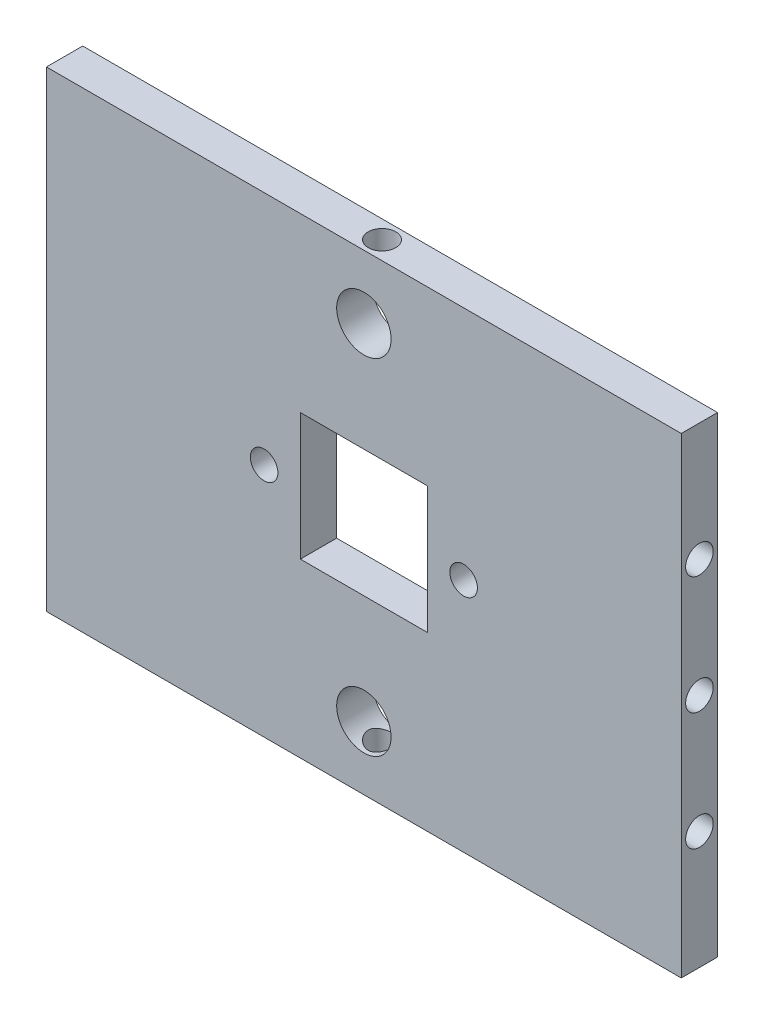
ISO-10303-21;
HEADER;
FILE_DESCRIPTION(('STEP AP214'),'2;1');
FILE_NAME('part.step','',(''),(''),'','','');
FILE_SCHEMA(('AUTOMOTIVE_DESIGN { 1 0 10303 214 1 1 1 1 }'));
ENDSEC;
DATA;
#1=APPLICATION_CONTEXT('core data for automotive mechanical design processes');
#2=APPLICATION_PROTOCOL_DEFINITION('international standard','automotive_design',2000,#1);
#3=PRODUCT_CONTEXT('',#1,'mechanical');
#4=PRODUCT('Part','Part','',(#3));
#5=PRODUCT_RELATED_PRODUCT_CATEGORY('part','',(#4));
#6=PRODUCT_DEFINITION_FORMATION('','',#4);
#7=PRODUCT_DEFINITION_CONTEXT('part definition',#1,'design');
#8=PRODUCT_DEFINITION('design','',#6,#7);
#9=PRODUCT_DEFINITION_SHAPE('','',#8);
#10=(LENGTH_UNIT() NAMED_UNIT(*) SI_UNIT(.MILLI.,.METRE.));
#11=(NAMED_UNIT(*) PLANE_ANGLE_UNIT() SI_UNIT($,.RADIAN.));
#12=(NAMED_UNIT(*) SI_UNIT($,.STERADIAN.) SOLID_ANGLE_UNIT());
#13=UNCERTAINTY_MEASURE_WITH_UNIT(LENGTH_MEASURE(1.E-05),#10,'distance_accuracy_value','');
#14=(GEOMETRIC_REPRESENTATION_CONTEXT(3) GLOBAL_UNCERTAINTY_ASSIGNED_CONTEXT((#13)) GLOBAL_UNIT_ASSIGNED_CONTEXT((#10,
#11,#12)) REPRESENTATION_CONTEXT('',''));
#15=CARTESIAN_POINT('',(0.,0.,0.));
#16=DIRECTION('',(0.,0.,1.));
#17=DIRECTION('',(1.,0.,0.));
#18=AXIS2_PLACEMENT_3D('',#15,#16,#17);
#19=CARTESIAN_POINT('',(55.5625,-41.275,6.35));
#20=DIRECTION('',(0.,1.,0.));
#21=DIRECTION('',(-1.,0.,0.));
#22=AXIS2_PLACEMENT_3D('',#19,#20,#21);
#23=PLANE('',#22);
#24=DIRECTION('',(1.,0.,0.));
#25=VECTOR('',#24,1.);
#26=CARTESIAN_POINT('',(55.5625,-41.275,0.));
#27=LINE('',#26,#25);
#28=CARTESIAN_POINT('',(-55.5625,-41.275,0.));
#29=VERTEX_POINT('',#28);
#30=CARTESIAN_POINT('',(55.5625,-41.275,0.));
#31=VERTEX_POINT('',#30);
#32=EDGE_CURVE('E203',#29,#31,#27,.T.);
#33=ORIENTED_EDGE('',*,*,#32,.T.);
#34=DIRECTION('',(0.,0.,-1.));
#35=VECTOR('',#34,1.);
#36=CARTESIAN_POINT('',(55.5625,-41.275,6.35));
#37=LINE('',#36,#35);
#38=CARTESIAN_POINT('',(55.5625,-41.275,6.35));
#39=VERTEX_POINT('',#38);
#40=EDGE_CURVE('E213',#39,#31,#37,.T.);
#41=ORIENTED_EDGE('',*,*,#40,.F.);
#42=DIRECTION('',(1.,0.,0.));
#43=VECTOR('',#42,1.);
#44=CARTESIAN_POINT('',(55.5625,-41.275,6.35));
#45=LINE('',#44,#43);
#46=CARTESIAN_POINT('',(-55.5625,-41.275,6.35));
#47=VERTEX_POINT('',#46);
#48=EDGE_CURVE('E193',#47,#39,#45,.T.);
#49=ORIENTED_EDGE('',*,*,#48,.F.);
#50=DIRECTION('',(0.,0.,-1.));
#51=VECTOR('',#50,1.);
#52=CARTESIAN_POINT('',(-55.5625,-41.275,6.35));
#53=LINE('',#52,#51);
#54=EDGE_CURVE('E216',#47,#29,#53,.T.);
#55=ORIENTED_EDGE('',*,*,#54,.T.);
#56=EDGE_LOOP('',(#33,#41,#49,#55));
#57=FACE_BOUND('',#56,.T.);
#58=CARTESIAN_POINT('',(0.,-41.275,3.175));
#59=DIRECTION('',(0.,1.,0.));
#60=DIRECTION('',(-1.,0.,0.));
#61=AXIS2_PLACEMENT_3D('',#58,#59,#60);
#62=CIRCLE('',#61,2.413);
#63=CARTESIAN_POINT('',(-2.41299999999999,-41.275,3.175));
#64=VERTEX_POINT('',#63);
#65=EDGE_CURVE('E133',#64,#64,#62,.T.);
#66=ORIENTED_EDGE('',*,*,#65,.T.);
#67=EDGE_LOOP('',(#66));
#68=FACE_BOUND('',#67,.T.);
#69=ADVANCED_FACE('F32',(#57,#68),#23,.F.);
#70=CARTESIAN_POINT('',(0.,-30.1625,6.35));
#71=DIRECTION('',(0.,0.,-1.));
#72=DIRECTION('',(-1.,0.,0.));
#73=AXIS2_PLACEMENT_3D('',#70,#71,#72);
#74=CYLINDRICAL_SURFACE('',#73,4.7625);
#75=CARTESIAN_POINT('',(0.,-30.1625,0.));
#76=DIRECTION('',(0.,0.,1.));
#77=DIRECTION('',(-1.,0.,0.));
#78=AXIS2_PLACEMENT_3D('',#75,#76,#77);
#79=CIRCLE('',#78,4.7625);
#80=CARTESIAN_POINT('',(-4.76249999999999,-30.1625,0.));
#81=VERTEX_POINT('',#80);
#82=EDGE_CURVE('E175',#81,#81,#79,.T.);
#83=ORIENTED_EDGE('',*,*,#82,.F.);
#84=EDGE_LOOP('',(#83));
#85=FACE_BOUND('',#84,.T.);
#86=CARTESIAN_POINT('',(0.,-30.1625,6.35));
#87=DIRECTION('',(0.,0.,1.));
#88=DIRECTION('',(-1.,0.,0.));
#89=AXIS2_PLACEMENT_3D('',#86,#87,#88);
#90=CIRCLE('',#89,4.7625);
#91=CARTESIAN_POINT('',(-4.76249999999999,-30.1625,6.35));
#92=VERTEX_POINT('',#91);
#93=EDGE_CURVE('E178',#92,#92,#90,.T.);
#94=ORIENTED_EDGE('',*,*,#93,.T.);
#95=EDGE_LOOP('',(#94));
#96=FACE_BOUND('',#95,.T.);
#97=CARTESIAN_POINT('',(2.41300000000001,-34.2684514427231,3.175));
#98=CARTESIAN_POINT('',(2.41298959719725,-34.2684642782932,3.30047043207857));
#99=CARTESIAN_POINT('',(2.40314718865454,-34.2742912555838,3.42609849758333));
#100=CARTESIAN_POINT('',(2.36428568016307,-34.2967507465352,3.67347477892594));
#101=CARTESIAN_POINT('',(2.33522736530901,-34.3134053555351,3.79521452596848));
#102=CARTESIAN_POINT('',(2.25952477625305,-34.3550877986089,4.030769610234));
#103=CARTESIAN_POINT('',(2.21297597061041,-34.3800700954961,4.14462406264938));
#104=CARTESIAN_POINT('',(2.10390518974434,-34.4355224660189,4.36287751327027));
#105=CARTESIAN_POINT('',(2.04138198754218,-34.4659929611449,4.46727578432047));
#106=CARTESIAN_POINT('',(1.89592129073469,-34.5321442044983,4.67342732710245));
#107=CARTESIAN_POINT('',(1.81170207851239,-34.5680476684607,4.77420517139413));
#108=CARTESIAN_POINT('',(1.62790296924237,-34.6392235569228,4.96096736840377));
#109=CARTESIAN_POINT('',(1.52831528093832,-34.6744956511623,5.04694417050078));
#110=CARTESIAN_POINT('',(1.30813045270683,-34.7433728760921,5.2075319339098));
#111=CARTESIAN_POINT('',(1.18655293508997,-34.7766906261296,5.28093358665196));
#112=CARTESIAN_POINT('',(0.930770162772574,-34.8349970482044,5.40579547408423));
#113=CARTESIAN_POINT('',(0.796573156353471,-34.8599911128632,5.45726992069383));
#114=CARTESIAN_POINT('',(0.529703085976592,-34.8972259875767,5.53292156586511));
#115=CARTESIAN_POINT('',(0.397629200091036,-34.9102622123706,5.55881198613326));
#116=CARTESIAN_POINT('',(0.130419357459133,-34.925089504113,5.58821217014395));
#117=CARTESIAN_POINT('',(-0.0047146362613206,-34.9268875859818,5.59173589534142));
#118=CARTESIAN_POINT('',(-0.261288495102825,-34.9194045392209,5.57694213264963));
#119=CARTESIAN_POINT('',(-0.382874270437069,-34.9110977758178,5.56054564514285));
#120=CARTESIAN_POINT('',(-0.621292363508594,-34.885822534913,5.50982779049476));
#121=CARTESIAN_POINT('',(-0.738124323984287,-34.8688534077055,5.47550507882298));
#122=CARTESIAN_POINT('',(-0.965723534567066,-34.8275141707143,5.38971157416185));
#123=CARTESIAN_POINT('',(-1.07638734206715,-34.8030470322369,5.33801505128527));
#124=CARTESIAN_POINT('',(-1.28773137967186,-34.7489008749861,5.21926657465877));
#125=CARTESIAN_POINT('',(-1.38840805165303,-34.719220009075,5.15220917623517));
#126=CARTESIAN_POINT('',(-1.5872768433047,-34.6540404063108,4.99722628783866));
#127=CARTESIAN_POINT('',(-1.6842943615511,-34.6182566519651,4.9079124546381));
#128=CARTESIAN_POINT('',(-1.86261687332044,-34.5467119984472,4.71465484311577));
#129=CARTESIAN_POINT('',(-1.94390921550487,-34.5109511405578,4.61069940044455));
#130=CARTESIAN_POINT('',(-2.09378503845431,-34.4409068679264,4.38266528962568));
#131=CARTESIAN_POINT('',(-2.1611638423934,-34.4068798578664,4.25770813256719));
#132=CARTESIAN_POINT('',(-2.27344012148107,-34.3478243240243,3.9961205849381));
#133=CARTESIAN_POINT('',(-2.31836154575336,-34.3227862223101,3.85950281241909));
#134=CARTESIAN_POINT('',(-2.38075232098653,-34.2873788042606,3.5899237169561));
#135=CARTESIAN_POINT('',(-2.40012752840259,-34.2759977087234,3.45754170909794));
#136=CARTESIAN_POINT('',(-2.41663192890407,-34.2663286993642,3.19096185622633));
#137=CARTESIAN_POINT('',(-2.4137778396488,-34.268030946133,3.0567654515499));
#138=CARTESIAN_POINT('',(-2.38765409638552,-34.2832616470244,2.80666634300608));
#139=CARTESIAN_POINT('',(-2.36674462939633,-34.2954222721502,2.69041968011811));
#140=CARTESIAN_POINT('',(-2.30864143407972,-34.3281553265606,2.46331899317455));
#141=CARTESIAN_POINT('',(-2.27144224606701,-34.3487305759492,2.35246679098655));
#142=CARTESIAN_POINT('',(-2.18002666174668,-34.3970801662797,2.13347042165862));
#143=CARTESIAN_POINT('',(-2.12510454857076,-34.425142767739,2.02568694529731));
#144=CARTESIAN_POINT('',(-2.00041157217394,-34.4850620484377,1.82023782562855));
#145=CARTESIAN_POINT('',(-1.93063306308114,-34.5169206775778,1.72257743081149));
#146=CARTESIAN_POINT('',(-1.76760250567714,-34.5858234602435,1.52684674893846));
#147=CARTESIAN_POINT('',(-1.6724774599989,-34.6230029165756,1.4303768962286));
#148=CARTESIAN_POINT('',(-1.46683882016201,-34.694789658719,1.25424873069539));
#149=CARTESIAN_POINT('',(-1.35631960201397,-34.7293959973679,1.17459658880315));
#150=CARTESIAN_POINT('',(-1.11866661604913,-34.7934341488521,1.03236901423491));
#151=CARTESIAN_POINT('',(-0.991142595441608,-34.8226858249857,0.970358728177169));
#152=CARTESIAN_POINT('',(-0.725564086775186,-34.8713345763698,0.869298241995003));
#153=CARTESIAN_POINT('',(-0.587519213640791,-34.890740528229,0.830227355382719));
#154=CARTESIAN_POINT('',(-0.318716713889223,-34.9160595250824,0.779604976418332));
#155=CARTESIAN_POINT('',(-0.188480545270583,-34.923062367338,0.765826368972122));
#156=CARTESIAN_POINT('',(0.0726155489410017,-34.9262328990153,0.759564702235895));
#157=CARTESIAN_POINT('',(0.203475226036689,-34.9224045946478,0.767073769090063));
#158=CARTESIAN_POINT('',(0.452608925002284,-34.9049768331079,0.801722738961749));
#159=CARTESIAN_POINT('',(0.571129388396251,-34.8920678190175,0.82747636285195));
#160=CARTESIAN_POINT('',(0.801961054799566,-34.8584426519233,0.89598079860148));
#161=CARTESIAN_POINT('',(0.914271387194137,-34.8377254074291,0.938733986827927));
#162=CARTESIAN_POINT('',(1.13480267260668,-34.7892605504202,1.0418727993198));
#163=CARTESIAN_POINT('',(1.24265424239447,-34.7612543979166,1.1029230643282));
#164=CARTESIAN_POINT('',(1.4470197310289,-34.7011018355011,1.2400917930215));
#165=CARTESIAN_POINT('',(1.5435284410426,-34.6689535375412,1.31621713668873));
#166=CARTESIAN_POINT('',(1.73283872849973,-34.5998229519975,1.49035967367612));
#167=CARTESIAN_POINT('',(1.82426234873218,-34.562681756181,1.58981666924796));
#168=CARTESIAN_POINT('',(1.98965098475985,-34.4904159810185,1.80310011518249));
#169=CARTESIAN_POINT('',(2.06359983116589,-34.4552932919555,1.9169397254815));
#170=CARTESIAN_POINT('',(2.1942476612967,-34.3900569759987,2.16127032390193));
#171=CARTESIAN_POINT('',(2.25023530606393,-34.3601673604939,2.29221115944626));
#172=CARTESIAN_POINT('',(2.31646335056276,-34.3237529237911,2.49554634679165));
#173=CARTESIAN_POINT('',(2.33557123649977,-34.3130239825891,2.56441372758246));
#174=CARTESIAN_POINT('',(2.36765850523188,-34.2948049420943,2.70396433617474));
#175=CARTESIAN_POINT('',(2.38064213124901,-34.2873126006123,2.77464627084623));
#176=CARTESIAN_POINT('',(2.39794173497482,-34.2772728821239,2.90029767745757));
#177=CARTESIAN_POINT('',(2.40358148617512,-34.273975041233,2.95502919936537));
#178=CARTESIAN_POINT('',(2.41111302876599,-34.2695614298812,3.06483033264054));
#179=CARTESIAN_POINT('',(2.41300456836541,-34.2684458060139,3.11989996647179));
#180=CARTESIAN_POINT('',(2.41300000000001,-34.2684514427231,3.175));
#181=B_SPLINE_CURVE_WITH_KNOTS('',3,(#97,#98,#99,#100,#101,#102,#103,#104,#105,#106,#107,#108,
#109,#110,#111,#112,#113,#114,#115,#116,#117,#118,#119,#120,#121,#122,#123,#124,#125,#126,#127,
#128,#129,#130,#131,#132,#133,#134,#135,#136,#137,#138,#139,#140,#141,#142,#143,#144,#145,#146,
#147,#148,#149,#150,#151,#152,#153,#154,#155,#156,#157,#158,#159,#160,#161,#162,#163,#164,#165,
#166,#167,#168,#169,#170,#171,#172,#173,#174,#175,#176,#177,#178,#179,#180),.UNSPECIFIED.,.T.,
.F.,(4,2,2,2,2,2,2,2,2,2,2,2,2,2,2,2,2,2,2,2,2,2,2,2,2,2,2,2,2,2,2,2,2,2,2,2,2,2,2,2,2,4),(0.,
0.37618822892474,0.753146543850161,1.12807650665735,1.50303527615293,1.90979790652876,
2.31676743228543,2.75209273661076,3.18713545790192,3.59053368294288,3.99368007907376,
4.36085058994704,4.72804864386794,5.1002148759916,5.47251322738946,5.88069274414447,
6.28919929911487,6.72487227779818,7.16007964726322,7.56053080596972,7.96068083237494,
8.31529503877274,8.67002818923127,9.04112183933797,9.41240693714612,9.8320075188292,
10.2517617982206,10.6837456980933,11.1153394390999,11.5066726658481,11.8978611656857,
12.262133362244,12.6264564982826,13.0060681057285,13.3858533617061,13.8043077188214,
14.2231477683155,14.6569640464722,14.8734832858582,15.0898522877214,15.2550433322878,
15.4202454734081),.UNSPECIFIED.);
#182=CARTESIAN_POINT('',(2.41300000000001,-34.2684514427231,3.175));
#183=VERTEX_POINT('',#182);
#184=EDGE_CURVE('E136',#183,#183,#181,.T.);
#185=ORIENTED_EDGE('',*,*,#184,.T.);
#186=EDGE_LOOP('',(#185));
#187=FACE_BOUND('',#186,.T.);
#188=ADVANCED_FACE('F289',(#85,#96,#187),#74,.F.);
#189=CARTESIAN_POINT('',(-55.5625,-41.275,6.35));
#190=DIRECTION('',(1.,0.,0.));
#191=DIRECTION('',(0.,0.,-1.));
#192=AXIS2_PLACEMENT_3D('',#189,#190,#191);
#193=PLANE('',#192);
#194=CARTESIAN_POINT('',(-55.5625,0.,3.175));
#195=DIRECTION('',(1.,0.,0.));
#196=DIRECTION('',(0.,0.,-1.));
#197=AXIS2_PLACEMENT_3D('',#194,#195,#196);
#198=CIRCLE('',#197,2.413);
#199=CARTESIAN_POINT('',(-55.5625,0.,0.762));
#200=VERTEX_POINT('',#199);
#201=EDGE_CURVE('E144',#200,#200,#198,.T.);
#202=ORIENTED_EDGE('',*,*,#201,.T.);
#203=EDGE_LOOP('',(#202));
#204=FACE_BOUND('',#203,.T.);
#205=DIRECTION('',(0.,-1.,0.));
#206=VECTOR('',#205,1.);
#207=CARTESIAN_POINT('',(-55.5625,-41.275,0.));
#208=LINE('',#207,#206);
#209=CARTESIAN_POINT('',(-55.5625,41.275,0.));
#210=VERTEX_POINT('',#209);
#211=EDGE_CURVE('E187',#210,#29,#208,.T.);
#212=ORIENTED_EDGE('',*,*,#211,.T.);
#213=ORIENTED_EDGE('',*,*,#54,.F.);
#214=DIRECTION('',(0.,-1.,0.));
#215=VECTOR('',#214,1.);
#216=CARTESIAN_POINT('',(-55.5625,-41.275,6.35));
#217=LINE('',#216,#215);
#218=CARTESIAN_POINT('',(-55.5625,41.275,6.35));
#219=VERTEX_POINT('',#218);
#220=EDGE_CURVE('E190',#219,#47,#217,.T.);
#221=ORIENTED_EDGE('',*,*,#220,.F.);
#222=DIRECTION('',(0.,0.,-1.));
#223=VECTOR('',#222,1.);
#224=CARTESIAN_POINT('',(-55.5625,41.275,6.35));
#225=LINE('',#224,#223);
#226=EDGE_CURVE('E200',#219,#210,#225,.T.);
#227=ORIENTED_EDGE('',*,*,#226,.T.);
#228=EDGE_LOOP('',(#212,#213,#221,#227));
#229=FACE_BOUND('',#228,.T.);
#230=CARTESIAN_POINT('',(-55.5625,20.6375,3.175));
#231=DIRECTION('',(1.,0.,0.));
#232=DIRECTION('',(0.,0.,-1.));
#233=AXIS2_PLACEMENT_3D('',#230,#231,#232);
#234=CIRCLE('',#233,2.413);
#235=CARTESIAN_POINT('',(-55.5625,20.6375,0.762));
#236=VERTEX_POINT('',#235);
#237=EDGE_CURVE('E151',#236,#236,#234,.T.);
#238=ORIENTED_EDGE('',*,*,#237,.T.);
#239=EDGE_LOOP('',(#238));
#240=FACE_BOUND('',#239,.T.);
#241=CARTESIAN_POINT('',(-55.5625,-20.6375,3.175));
#242=DIRECTION('',(1.,0.,0.));
#243=DIRECTION('',(0.,0.,-1.));
#244=AXIS2_PLACEMENT_3D('',#241,#242,#243);
#245=CIRCLE('',#244,2.413);
#246=CARTESIAN_POINT('',(-55.5625,-20.6375,0.762));
#247=VERTEX_POINT('',#246);
#248=EDGE_CURVE('E145',#247,#247,#245,.T.);
#249=ORIENTED_EDGE('',*,*,#248,.T.);
#250=EDGE_LOOP('',(#249));
#251=FACE_BOUND('',#250,.T.);
#252=ADVANCED_FACE('F34',(#204,#229,#240,#251),#193,.F.);
#253=CARTESIAN_POINT('',(0.,0.,6.35));
#254=DIRECTION('',(0.,0.,1.));
#255=DIRECTION('',(1.,0.,0.));
#256=AXIS2_PLACEMENT_3D('',#253,#254,#255);
#257=PLANE('',#256);
#258=DIRECTION('',(0.,-1.,0.));
#259=VECTOR('',#258,1.);
#260=CARTESIAN_POINT('',(-11.1125,-11.1125,6.35));
#261=LINE('',#260,#259);
#262=CARTESIAN_POINT('',(-11.1125,11.1125,6.35));
#263=VERTEX_POINT('',#262);
#264=CARTESIAN_POINT('',(-11.1125,-11.1125,6.35));
#265=VERTEX_POINT('',#264);
#266=EDGE_CURVE('E47',#263,#265,#261,.T.);
#267=ORIENTED_EDGE('',*,*,#266,.F.);
#268=DIRECTION('',(-1.,0.,0.));
#269=VECTOR('',#268,1.);
#270=CARTESIAN_POINT('',(11.1125,11.1125,6.35));
#271=LINE('',#270,#269);
#272=CARTESIAN_POINT('',(11.1125,11.1125,6.35));
#273=VERTEX_POINT('',#272);
#274=EDGE_CURVE('E116',#273,#263,#271,.T.);
#275=ORIENTED_EDGE('',*,*,#274,.F.);
#276=DIRECTION('',(0.,1.,0.));
#277=VECTOR('',#276,1.);
#278=CARTESIAN_POINT('',(11.1125,-11.1125,6.35));
#279=LINE('',#278,#277);
#280=CARTESIAN_POINT('',(11.1125,-11.1125,6.35));
#281=VERTEX_POINT('',#280);
#282=EDGE_CURVE('E100',#281,#273,#279,.T.);
#283=ORIENTED_EDGE('',*,*,#282,.F.);
#284=DIRECTION('',(1.,0.,0.));
#285=VECTOR('',#284,1.);
#286=CARTESIAN_POINT('',(11.1125,-11.1125,6.35));
#287=LINE('',#286,#285);
#288=EDGE_CURVE('E109',#265,#281,#287,.T.);
#289=ORIENTED_EDGE('',*,*,#288,.F.);
#290=EDGE_LOOP('',(#267,#275,#283,#289));
#291=FACE_BOUND('',#290,.T.);
#292=CARTESIAN_POINT('',(-17.4625,0.,6.35));
#293=DIRECTION('',(0.,0.,1.));
#294=DIRECTION('',(1.,0.,0.));
#295=AXIS2_PLACEMENT_3D('',#292,#293,#294);
#296=CIRCLE('',#295,2.413);
#297=CARTESIAN_POINT('',(-15.0495,0.,6.35));
#298=VERTEX_POINT('',#297);
#299=EDGE_CURVE('E123',#298,#298,#296,.T.);
#300=ORIENTED_EDGE('',*,*,#299,.F.);
#301=EDGE_LOOP('',(#300));
#302=FACE_BOUND('',#301,.T.);
#303=CARTESIAN_POINT('',(17.4625,0.,6.35));
#304=DIRECTION('',(0.,0.,1.));
#305=DIRECTION('',(1.,0.,0.));
#306=AXIS2_PLACEMENT_3D('',#303,#304,#305);
#307=CIRCLE('',#306,2.413);
#308=CARTESIAN_POINT('',(19.8755,0.,6.35));
#309=VERTEX_POINT('',#308);
#310=EDGE_CURVE('E129',#309,#309,#307,.T.);
#311=ORIENTED_EDGE('',*,*,#310,.F.);
#312=EDGE_LOOP('',(#311));
#313=FACE_BOUND('',#312,.T.);
#314=CARTESIAN_POINT('',(0.,30.1625,6.35));
#315=DIRECTION('',(0.,0.,1.));
#316=DIRECTION('',(1.,0.,0.));
#317=AXIS2_PLACEMENT_3D('',#314,#315,#316);
#318=CIRCLE('',#317,4.7625);
#319=CARTESIAN_POINT('',(4.76250000000001,30.1625,6.35));
#320=VERTEX_POINT('',#319);
#321=EDGE_CURVE('E184',#320,#320,#318,.T.);
#322=ORIENTED_EDGE('',*,*,#321,.F.);
#323=EDGE_LOOP('',(#322));
#324=FACE_BOUND('',#323,.T.);
#325=ORIENTED_EDGE('',*,*,#220,.T.);
#326=ORIENTED_EDGE('',*,*,#48,.T.);
#327=DIRECTION('',(0.,1.,0.));
#328=VECTOR('',#327,1.);
#329=CARTESIAN_POINT('',(55.5625,-41.275,6.35));
#330=LINE('',#329,#328);
#331=CARTESIAN_POINT('',(55.5625,41.275,6.35));
#332=VERTEX_POINT('',#331);
#333=EDGE_CURVE('E196',#39,#332,#330,.T.);
#334=ORIENTED_EDGE('',*,*,#333,.T.);
#335=DIRECTION('',(-1.,0.,0.));
#336=VECTOR('',#335,1.);
#337=CARTESIAN_POINT('',(55.5625,41.275,6.35));
#338=LINE('',#337,#336);
#339=EDGE_CURVE('E198',#332,#219,#338,.T.);
#340=ORIENTED_EDGE('',*,*,#339,.T.);
#341=EDGE_LOOP('',(#325,#326,#334,#340));
#342=FACE_BOUND('',#341,.T.);
#343=ORIENTED_EDGE('',*,*,#93,.F.);
#344=EDGE_LOOP('',(#343));
#345=FACE_BOUND('',#344,.T.);
#346=ADVANCED_FACE('F113',(#291,#302,#313,#324,#342,#345),#257,.T.);
#347=CARTESIAN_POINT('',(0.,0.,0.));
#348=DIRECTION('',(0.,0.,1.));
#349=DIRECTION('',(1.,0.,0.));
#350=AXIS2_PLACEMENT_3D('',#347,#348,#349);
#351=PLANE('',#350);
#352=DIRECTION('',(-1.,0.,0.));
#353=VECTOR('',#352,1.);
#354=CARTESIAN_POINT('',(0.,11.1125,0.));
#355=LINE('',#354,#353);
#356=CARTESIAN_POINT('',(11.1125,11.1125,0.));
#357=VERTEX_POINT('',#356);
#358=CARTESIAN_POINT('',(-11.1125,11.1125,0.));
#359=VERTEX_POINT('',#358);
#360=EDGE_CURVE('E40',#357,#359,#355,.T.);
#361=ORIENTED_EDGE('',*,*,#360,.T.);
#362=DIRECTION('',(0.,-1.,0.));
#363=VECTOR('',#362,1.);
#364=CARTESIAN_POINT('',(-11.1125,0.,0.));
#365=LINE('',#364,#363);
#366=CARTESIAN_POINT('',(-11.1125,-11.1125,0.));
#367=VERTEX_POINT('',#366);
#368=EDGE_CURVE('E11',#359,#367,#365,.T.);
#369=ORIENTED_EDGE('',*,*,#368,.T.);
#370=DIRECTION('',(1.,0.,0.));
#371=VECTOR('',#370,1.);
#372=CARTESIAN_POINT('',(0.,-11.1125,0.));
#373=LINE('',#372,#371);
#374=CARTESIAN_POINT('',(11.1125,-11.1125,0.));
#375=VERTEX_POINT('',#374);
#376=EDGE_CURVE('E219',#367,#375,#373,.T.);
#377=ORIENTED_EDGE('',*,*,#376,.T.);
#378=DIRECTION('',(0.,1.,0.));
#379=VECTOR('',#378,1.);
#380=CARTESIAN_POINT('',(11.1125,0.,0.));
#381=LINE('',#380,#379);
#382=EDGE_CURVE('E103',#375,#357,#381,.T.);
#383=ORIENTED_EDGE('',*,*,#382,.T.);
#384=EDGE_LOOP('',(#361,#369,#377,#383));
#385=FACE_BOUND('',#384,.T.);
#386=CARTESIAN_POINT('',(-17.4625,0.,0.));
#387=DIRECTION('',(0.,0.,1.));
#388=DIRECTION('',(1.,0.,0.));
#389=AXIS2_PLACEMENT_3D('',#386,#387,#388);
#390=CIRCLE('',#389,2.413);
#391=CARTESIAN_POINT('',(-15.0495,0.,0.));
#392=VERTEX_POINT('',#391);
#393=EDGE_CURVE('E128',#392,#392,#390,.T.);
#394=ORIENTED_EDGE('',*,*,#393,.T.);
#395=EDGE_LOOP('',(#394));
#396=FACE_BOUND('',#395,.T.);
#397=CARTESIAN_POINT('',(17.4625,0.,0.));
#398=DIRECTION('',(0.,0.,1.));
#399=DIRECTION('',(1.,0.,0.));
#400=AXIS2_PLACEMENT_3D('',#397,#398,#399);
#401=CIRCLE('',#400,2.413);
#402=CARTESIAN_POINT('',(19.8755,0.,0.));
#403=VERTEX_POINT('',#402);
#404=EDGE_CURVE('E132',#403,#403,#401,.T.);
#405=ORIENTED_EDGE('',*,*,#404,.T.);
#406=EDGE_LOOP('',(#405));
#407=FACE_BOUND('',#406,.T.);
#408=CARTESIAN_POINT('',(0.,30.1625,0.));
#409=DIRECTION('',(0.,0.,1.));
#410=DIRECTION('',(1.,0.,0.));
#411=AXIS2_PLACEMENT_3D('',#408,#409,#410);
#412=CIRCLE('',#411,4.7625);
#413=CARTESIAN_POINT('',(4.76250000000001,30.1625,0.));
#414=VERTEX_POINT('',#413);
#415=EDGE_CURVE('E181',#414,#414,#412,.T.);
#416=ORIENTED_EDGE('',*,*,#415,.T.);
#417=EDGE_LOOP('',(#416));
#418=FACE_BOUND('',#417,.T.);
#419=ORIENTED_EDGE('',*,*,#211,.F.);
#420=DIRECTION('',(-1.,0.,0.));
#421=VECTOR('',#420,1.);
#422=CARTESIAN_POINT('',(55.5625,41.275,0.));
#423=LINE('',#422,#421);
#424=CARTESIAN_POINT('',(55.5625,41.275,0.));
#425=VERTEX_POINT('',#424);
#426=EDGE_CURVE('E194',#425,#210,#423,.T.);
#427=ORIENTED_EDGE('',*,*,#426,.F.);
#428=DIRECTION('',(0.,1.,0.));
#429=VECTOR('',#428,1.);
#430=CARTESIAN_POINT('',(55.5625,-41.275,0.));
#431=LINE('',#430,#429);
#432=EDGE_CURVE('E205',#31,#425,#431,.T.);
#433=ORIENTED_EDGE('',*,*,#432,.F.);
#434=ORIENTED_EDGE('',*,*,#32,.F.);
#435=EDGE_LOOP('',(#419,#427,#433,#434));
#436=FACE_BOUND('',#435,.T.);
#437=ORIENTED_EDGE('',*,*,#82,.T.);
#438=EDGE_LOOP('',(#437));
#439=FACE_BOUND('',#438,.T.);
#440=ADVANCED_FACE('F338',(#385,#396,#407,#418,#436,#439),#351,.F.);
#441=CARTESIAN_POINT('',(55.5625,-41.275,6.35));
#442=DIRECTION('',(-1.,0.,0.));
#443=DIRECTION('',(0.,0.,1.));
#444=AXIS2_PLACEMENT_3D('',#441,#442,#443);
#445=PLANE('',#444);
#446=CARTESIAN_POINT('',(55.5625,-20.6375,3.175));
#447=DIRECTION('',(1.,0.,0.));
#448=DIRECTION('',(0.,0.,-1.));
#449=AXIS2_PLACEMENT_3D('',#446,#447,#448);
#450=CIRCLE('',#449,2.413);
#451=CARTESIAN_POINT('',(55.5625,-20.6375,0.762));
#452=VERTEX_POINT('',#451);
#453=EDGE_CURVE('E157',#452,#452,#450,.T.);
#454=ORIENTED_EDGE('',*,*,#453,.F.);
#455=EDGE_LOOP('',(#454));
#456=FACE_BOUND('',#455,.T.);
#457=CARTESIAN_POINT('',(55.5625,0.,3.175));
#458=DIRECTION('',(1.,0.,0.));
#459=DIRECTION('',(0.,0.,-1.));
#460=AXIS2_PLACEMENT_3D('',#457,#458,#459);
#461=CIRCLE('',#460,2.413);
#462=CARTESIAN_POINT('',(55.5625,0.,0.762));
#463=VERTEX_POINT('',#462);
#464=EDGE_CURVE('E163',#463,#463,#461,.T.);
#465=ORIENTED_EDGE('',*,*,#464,.F.);
#466=EDGE_LOOP('',(#465));
#467=FACE_BOUND('',#466,.T.);
#468=CARTESIAN_POINT('',(55.5625,20.6375,3.175));
#469=DIRECTION('',(1.,0.,0.));
#470=DIRECTION('',(0.,0.,-1.));
#471=AXIS2_PLACEMENT_3D('',#468,#469,#470);
#472=CIRCLE('',#471,2.413);
#473=CARTESIAN_POINT('',(55.5625,20.6375,0.762));
#474=VERTEX_POINT('',#473);
#475=EDGE_CURVE('E169',#474,#474,#472,.T.);
#476=ORIENTED_EDGE('',*,*,#475,.F.);
#477=EDGE_LOOP('',(#476));
#478=FACE_BOUND('',#477,.T.);
#479=ORIENTED_EDGE('',*,*,#432,.T.);
#480=DIRECTION('',(0.,0.,-1.));
#481=VECTOR('',#480,1.);
#482=CARTESIAN_POINT('',(55.5625,41.275,6.35));
#483=LINE('',#482,#481);
#484=EDGE_CURVE('E210',#332,#425,#483,.T.);
#485=ORIENTED_EDGE('',*,*,#484,.F.);
#486=ORIENTED_EDGE('',*,*,#333,.F.);
#487=ORIENTED_EDGE('',*,*,#40,.T.);
#488=EDGE_LOOP('',(#479,#485,#486,#487));
#489=FACE_BOUND('',#488,.T.);
#490=ADVANCED_FACE('F349',(#456,#467,#478,#489),#445,.F.);
#491=CARTESIAN_POINT('',(55.5625,41.275,6.35));
#492=DIRECTION('',(0.,-1.,0.));
#493=DIRECTION('',(1.,0.,0.));
#494=AXIS2_PLACEMENT_3D('',#491,#492,#493);
#495=PLANE('',#494);
#496=CARTESIAN_POINT('',(0.,41.275,3.175));
#497=DIRECTION('',(0.,1.,0.));
#498=DIRECTION('',(-1.,0.,0.));
#499=AXIS2_PLACEMENT_3D('',#496,#497,#498);
#500=CIRCLE('',#499,2.413);
#501=CARTESIAN_POINT('',(-2.41299999999999,41.275,3.175));
#502=VERTEX_POINT('',#501);
#503=EDGE_CURVE('E137',#502,#502,#500,.T.);
#504=ORIENTED_EDGE('',*,*,#503,.F.);
#505=EDGE_LOOP('',(#504));
#506=FACE_BOUND('',#505,.T.);
#507=ORIENTED_EDGE('',*,*,#426,.T.);
#508=ORIENTED_EDGE('',*,*,#226,.F.);
#509=ORIENTED_EDGE('',*,*,#339,.F.);
#510=ORIENTED_EDGE('',*,*,#484,.T.);
#511=EDGE_LOOP('',(#507,#508,#509,#510));
#512=FACE_BOUND('',#511,.T.);
#513=ADVANCED_FACE('F364',(#506,#512),#495,.F.);
#514=CARTESIAN_POINT('',(0.,30.1625,6.35));
#515=DIRECTION('',(0.,0.,-1.));
#516=DIRECTION('',(-1.,0.,0.));
#517=AXIS2_PLACEMENT_3D('',#514,#515,#516);
#518=CYLINDRICAL_SURFACE('',#517,4.7625);
#519=CARTESIAN_POINT('',(-2.41299999999999,34.2684514427231,3.175));
#520=CARTESIAN_POINT('',(-2.41298959719723,34.2684642782932,3.04952956792143));
#521=CARTESIAN_POINT('',(-2.40314718865452,34.2742912555838,2.92390150241667));
#522=CARTESIAN_POINT('',(-2.36428568016305,34.2967507465352,2.67652522107406));
#523=CARTESIAN_POINT('',(-2.33522736530899,34.3134053555351,2.55478547403152));
#524=CARTESIAN_POINT('',(-2.25952477625303,34.3550877986089,2.319230389766));
#525=CARTESIAN_POINT('',(-2.21297597061039,34.3800700954961,2.20537593735062));
#526=CARTESIAN_POINT('',(-2.10390518974432,34.4355224660189,1.98712248672973));
#527=CARTESIAN_POINT('',(-2.04138198754215,34.4659929611449,1.88272421567953));
#528=CARTESIAN_POINT('',(-1.89592129073467,34.5321442044983,1.67657267289755));
#529=CARTESIAN_POINT('',(-1.81170207851237,34.5680476684607,1.57579482860587));
#530=CARTESIAN_POINT('',(-1.62790296924235,34.6392235569228,1.38903263159623));
#531=CARTESIAN_POINT('',(-1.5283152809383,34.6744956511623,1.30305582949922));
#532=CARTESIAN_POINT('',(-1.30813045270681,34.7433728760921,1.1424680660902));
#533=CARTESIAN_POINT('',(-1.18655293508995,34.7766906261296,1.06906641334804));
#534=CARTESIAN_POINT('',(-0.930770162772554,34.8349970482044,0.944204525915773));
#535=CARTESIAN_POINT('',(-0.796573156353452,34.8599911128632,0.892730079306169));
#536=CARTESIAN_POINT('',(-0.529703085976573,34.8972259875767,0.817078434134892));
#537=CARTESIAN_POINT('',(-0.397629200091017,34.9102622123706,0.791188013866745));
#538=CARTESIAN_POINT('',(-0.130419357459115,34.925089504113,0.76178782985605));
#539=CARTESIAN_POINT('',(0.0047146362613396,34.9268875859818,0.75826410465858));
#540=CARTESIAN_POINT('',(0.261288495102843,34.9194045392209,0.773057867350371));
#541=CARTESIAN_POINT('',(0.382874270437086,34.9110977758178,0.789454354857148));
#542=CARTESIAN_POINT('',(0.621292363508612,34.885822534913,0.840172209505244));
#543=CARTESIAN_POINT('',(0.738124323984305,34.8688534077055,0.874494921177024));
#544=CARTESIAN_POINT('',(0.965723534567085,34.8275141707143,0.960288425838147));
#545=CARTESIAN_POINT('',(1.07638734206716,34.8030470322369,1.01198494871473));
#546=CARTESIAN_POINT('',(1.28773137967188,34.7489008749861,1.13073342534123));
#547=CARTESIAN_POINT('',(1.38840805165305,34.719220009075,1.19779082376483));
#548=CARTESIAN_POINT('',(1.58727684330472,34.6540404063108,1.35277371216134));
#549=CARTESIAN_POINT('',(1.68429436155112,34.6182566519651,1.4420875453619));
#550=CARTESIAN_POINT('',(1.86261687332046,34.5467119984472,1.63534515688423));
#551=CARTESIAN_POINT('',(1.94390921550489,34.5109511405578,1.73930059955545));
#552=CARTESIAN_POINT('',(2.09378503845433,34.4409068679264,1.96733471037432));
#553=CARTESIAN_POINT('',(2.16116384239342,34.4068798578664,2.09229186743281));
#554=CARTESIAN_POINT('',(2.27344012148109,34.3478243240243,2.3538794150619));
#555=CARTESIAN_POINT('',(2.31836154575338,34.3227862223101,2.49049718758091));
#556=CARTESIAN_POINT('',(2.38075232098655,34.2873788042606,2.7600762830439));
#557=CARTESIAN_POINT('',(2.40012752840261,34.2759977087234,2.89245829090206));
#558=CARTESIAN_POINT('',(2.41663192890409,34.2663286993641,3.15903814377367));
#559=CARTESIAN_POINT('',(2.41377783964882,34.268030946133,3.2932345484501));
#560=CARTESIAN_POINT('',(2.38765409638554,34.2832616470244,3.54333365699392));
#561=CARTESIAN_POINT('',(2.36674462939635,34.2954222721502,3.65958031988189));
#562=CARTESIAN_POINT('',(2.30864143407974,34.3281553265606,3.88668100682545));
#563=CARTESIAN_POINT('',(2.27144224606703,34.3487305759492,3.99753320901345));
#564=CARTESIAN_POINT('',(2.1800266617467,34.3970801662797,4.21652957834138));
#565=CARTESIAN_POINT('',(2.12510454857078,34.425142767739,4.32431305470269));
#566=CARTESIAN_POINT('',(2.00041157217396,34.4850620484377,4.52976217437145));
#567=CARTESIAN_POINT('',(1.93063306308116,34.5169206775778,4.62742256918851));
#568=CARTESIAN_POINT('',(1.76760250567716,34.5858234602435,4.82315325106154));
#569=CARTESIAN_POINT('',(1.67247745999892,34.6230029165756,4.9196231037714));
#570=CARTESIAN_POINT('',(1.46683882016203,34.694789658719,5.09575126930461));
#571=CARTESIAN_POINT('',(1.35631960201399,34.729395997368,5.17540341119684));
#572=CARTESIAN_POINT('',(1.11866661604915,34.7934341488521,5.31763098576508));
#573=CARTESIAN_POINT('',(0.99114259544163,34.8226858249857,5.37964127182283));
#574=CARTESIAN_POINT('',(0.725564086775207,34.8713345763698,5.480701758005));
#575=CARTESIAN_POINT('',(0.587519213640812,34.890740528229,5.51977264461728));
#576=CARTESIAN_POINT('',(0.318716713889244,34.9160595250824,5.57039502358167));
#577=CARTESIAN_POINT('',(0.188480545270604,34.923062367338,5.58417363102788));
#578=CARTESIAN_POINT('',(-0.0726155489409811,34.9262328990153,5.59043529776411));
#579=CARTESIAN_POINT('',(-0.203475226036669,34.9224045946478,5.58292623090994));
#580=CARTESIAN_POINT('',(-0.452608925002264,34.9049768331079,5.54827726103825));
#581=CARTESIAN_POINT('',(-0.571129388396231,34.8920678190175,5.52252363714805));
#582=CARTESIAN_POINT('',(-0.801961054799546,34.8584426519233,5.45401920139852));
#583=CARTESIAN_POINT('',(-0.914271387194117,34.8377254074291,5.41126601317207));
#584=CARTESIAN_POINT('',(-1.13480267260666,34.7892605504202,5.3081272006802));
#585=CARTESIAN_POINT('',(-1.24265424239445,34.7612543979166,5.2470769356718));
#586=CARTESIAN_POINT('',(-1.44701973102888,34.7011018355011,5.1099082069785));
#587=CARTESIAN_POINT('',(-1.54352844104258,34.6689535375412,5.03378286331128));
#588=CARTESIAN_POINT('',(-1.73283872849971,34.5998229519975,4.85964032632388));
#589=CARTESIAN_POINT('',(-1.82426234873216,34.562681756181,4.76018333075204));
#590=CARTESIAN_POINT('',(-1.98965098475983,34.4904159810185,4.54689988481751));
#591=CARTESIAN_POINT('',(-2.06359983116587,34.4552932919555,4.4330602745185));
#592=CARTESIAN_POINT('',(-2.19424766129668,34.3900569759987,4.18872967609807));
#593=CARTESIAN_POINT('',(-2.25023530606391,34.3601673604939,4.05778884055374));
#594=CARTESIAN_POINT('',(-2.31646335056274,34.3237529237911,3.85445365320835));
#595=CARTESIAN_POINT('',(-2.33557123649975,34.3130239825891,3.78558627241754));
#596=CARTESIAN_POINT('',(-2.36765850523186,34.2948049420943,3.64603566382526));
#597=CARTESIAN_POINT('',(-2.38064213124899,34.2873126006123,3.57535372915377));
#598=CARTESIAN_POINT('',(-2.3979417349748,34.2772728821239,3.44970232254243));
#599=CARTESIAN_POINT('',(-2.4035814861751,34.273975041233,3.39497080063464));
#600=CARTESIAN_POINT('',(-2.41111302876597,34.2695614298812,3.28516966735946));
#601=CARTESIAN_POINT('',(-2.41300456836539,34.2684458060139,3.23010003352821));
#602=CARTESIAN_POINT('',(-2.41299999999999,34.2684514427231,3.175));
#603=B_SPLINE_CURVE_WITH_KNOTS('',3,(#519,#520,#521,#522,#523,#524,#525,#526,#527,#528,#529,
#530,#531,#532,#533,#534,#535,#536,#537,#538,#539,#540,#541,#542,#543,#544,#545,#546,#547,#548,
#549,#550,#551,#552,#553,#554,#555,#556,#557,#558,#559,#560,#561,#562,#563,#564,#565,#566,#567,
#568,#569,#570,#571,#572,#573,#574,#575,#576,#577,#578,#579,#580,#581,#582,#583,#584,#585,#586,
#587,#588,#589,#590,#591,#592,#593,#594,#595,#596,#597,#598,#599,#600,#601,#602),.UNSPECIFIED.,
.T.,.F.,(4,2,2,2,2,2,2,2,2,2,2,2,2,2,2,2,2,2,2,2,2,2,2,2,2,2,2,2,2,2,2,2,2,2,2,2,2,2,2,2,2,4),
(0.,0.37618822892474,0.753146543850162,1.12807650665736,1.50303527615293,1.90979790652877,
2.31676743228543,2.75209273661076,3.18713545790192,3.59053368294287,3.99368007907376,
4.36085058994704,4.72804864386794,5.10021487599159,5.47251322738946,5.88069274414447,
6.28919929911486,6.72487227779818,7.16007964726322,7.56053080596972,7.96068083237494,
8.31529503877274,8.67002818923127,9.04112183933797,9.41240693714612,9.8320075188292,
10.2517617982206,10.6837456980933,11.1153394390999,11.5066726658481,11.8978611656857,
12.262133362244,12.6264564982826,13.0060681057285,13.3858533617061,13.8043077188214,
14.2231477683155,14.6569640464722,14.8734832858582,15.0898522877214,15.2550433322878,
15.4202454734081),.UNSPECIFIED.);
#604=CARTESIAN_POINT('',(-2.41299999999999,34.2684514427231,3.175));
#605=VERTEX_POINT('',#604);
#606=EDGE_CURVE('E140',#605,#605,#603,.T.);
#607=ORIENTED_EDGE('',*,*,#606,.F.);
#608=EDGE_LOOP('',(#607));
#609=FACE_BOUND('',#608,.T.);
#610=ORIENTED_EDGE('',*,*,#321,.T.);
#611=EDGE_LOOP('',(#610));
#612=FACE_BOUND('',#611,.T.);
#613=ORIENTED_EDGE('',*,*,#415,.F.);
#614=EDGE_LOOP('',(#613));
#615=FACE_BOUND('',#614,.T.);
#616=ADVANCED_FACE('F231',(#609,#612,#615),#518,.F.);
#617=CARTESIAN_POINT('',(42.8625,20.6375,3.175));
#618=DIRECTION('',(1.,0.,0.));
#619=DIRECTION('',(0.,0.,-1.));
#620=AXIS2_PLACEMENT_3D('',#617,#618,#619);
#621=CYLINDRICAL_SURFACE('',#620,2.413);
#622=CARTESIAN_POINT('',(42.8625,20.6375,3.175));
#623=DIRECTION('',(1.,0.,0.));
#624=DIRECTION('',(0.,0.,-1.));
#625=AXIS2_PLACEMENT_3D('',#622,#623,#624);
#626=CIRCLE('',#625,2.413);
#627=CARTESIAN_POINT('',(42.8625,20.6375,0.762));
#628=VERTEX_POINT('',#627);
#629=EDGE_CURVE('E172',#628,#628,#626,.T.);
#630=ORIENTED_EDGE('',*,*,#629,.F.);
#631=EDGE_LOOP('',(#630));
#632=FACE_BOUND('',#631,.T.);
#633=ORIENTED_EDGE('',*,*,#475,.T.);
#634=EDGE_LOOP('',(#633));
#635=FACE_BOUND('',#634,.T.);
#636=ADVANCED_FACE('F285',(#632,#635),#621,.F.);
#637=CARTESIAN_POINT('',(42.8625,20.6375,3.175));
#638=DIRECTION('',(1.,0.,0.));
#639=DIRECTION('',(0.,0.,-1.));
#640=AXIS2_PLACEMENT_3D('',#637,#638,#639);
#641=PLANE('',#640);
#642=ORIENTED_EDGE('',*,*,#629,.T.);
#643=EDGE_LOOP('',(#642));
#644=FACE_BOUND('',#643,.T.);
#645=ADVANCED_FACE('F281',(#644),#641,.T.);
#646=CARTESIAN_POINT('',(42.8625,0.,3.175));
#647=DIRECTION('',(1.,0.,0.));
#648=DIRECTION('',(0.,0.,-1.));
#649=AXIS2_PLACEMENT_3D('',#646,#647,#648);
#650=CYLINDRICAL_SURFACE('',#649,2.413);
#651=CARTESIAN_POINT('',(42.8625,0.,3.175));
#652=DIRECTION('',(1.,0.,0.));
#653=DIRECTION('',(0.,0.,-1.));
#654=AXIS2_PLACEMENT_3D('',#651,#652,#653);
#655=CIRCLE('',#654,2.413);
#656=CARTESIAN_POINT('',(42.8625,0.,0.762));
#657=VERTEX_POINT('',#656);
#658=EDGE_CURVE('E166',#657,#657,#655,.T.);
#659=ORIENTED_EDGE('',*,*,#658,.F.);
#660=EDGE_LOOP('',(#659));
#661=FACE_BOUND('',#660,.T.);
#662=ORIENTED_EDGE('',*,*,#464,.T.);
#663=EDGE_LOOP('',(#662));
#664=FACE_BOUND('',#663,.T.);
#665=ADVANCED_FACE('F277',(#661,#664),#650,.F.);
#666=CARTESIAN_POINT('',(42.8625,0.,3.175));
#667=DIRECTION('',(1.,0.,0.));
#668=DIRECTION('',(0.,0.,-1.));
#669=AXIS2_PLACEMENT_3D('',#666,#667,#668);
#670=PLANE('',#669);
#671=ORIENTED_EDGE('',*,*,#658,.T.);
#672=EDGE_LOOP('',(#671));
#673=FACE_BOUND('',#672,.T.);
#674=ADVANCED_FACE('F273',(#673),#670,.T.);
#675=CARTESIAN_POINT('',(42.8625,-20.6375,3.175));
#676=DIRECTION('',(1.,0.,0.));
#677=DIRECTION('',(0.,0.,-1.));
#678=AXIS2_PLACEMENT_3D('',#675,#676,#677);
#679=CYLINDRICAL_SURFACE('',#678,2.413);
#680=CARTESIAN_POINT('',(42.8625,-20.6375,3.175));
#681=DIRECTION('',(1.,0.,0.));
#682=DIRECTION('',(0.,0.,-1.));
#683=AXIS2_PLACEMENT_3D('',#680,#681,#682);
#684=CIRCLE('',#683,2.413);
#685=CARTESIAN_POINT('',(42.8625,-20.6375,0.762));
#686=VERTEX_POINT('',#685);
#687=EDGE_CURVE('E160',#686,#686,#684,.T.);
#688=ORIENTED_EDGE('',*,*,#687,.F.);
#689=EDGE_LOOP('',(#688));
#690=FACE_BOUND('',#689,.T.);
#691=ORIENTED_EDGE('',*,*,#453,.T.);
#692=EDGE_LOOP('',(#691));
#693=FACE_BOUND('',#692,.T.);
#694=ADVANCED_FACE('F269',(#690,#693),#679,.F.);
#695=CARTESIAN_POINT('',(42.8625,-20.6375,3.175));
#696=DIRECTION('',(1.,0.,0.));
#697=DIRECTION('',(0.,0.,-1.));
#698=AXIS2_PLACEMENT_3D('',#695,#696,#697);
#699=PLANE('',#698);
#700=ORIENTED_EDGE('',*,*,#687,.T.);
#701=EDGE_LOOP('',(#700));
#702=FACE_BOUND('',#701,.T.);
#703=ADVANCED_FACE('F265',(#702),#699,.T.);
#704=CARTESIAN_POINT('',(-42.8625,20.6375,3.175));
#705=DIRECTION('',(-1.,0.,0.));
#706=DIRECTION('',(0.,0.,1.));
#707=AXIS2_PLACEMENT_3D('',#704,#705,#706);
#708=CYLINDRICAL_SURFACE('',#707,2.413);
#709=CARTESIAN_POINT('',(-42.8625,20.6375,3.175));
#710=DIRECTION('',(1.,0.,0.));
#711=DIRECTION('',(0.,0.,-1.));
#712=AXIS2_PLACEMENT_3D('',#709,#710,#711);
#713=CIRCLE('',#712,2.413);
#714=CARTESIAN_POINT('',(-42.8625,20.6375,0.762));
#715=VERTEX_POINT('',#714);
#716=EDGE_CURVE('E154',#715,#715,#713,.T.);
#717=ORIENTED_EDGE('',*,*,#716,.T.);
#718=EDGE_LOOP('',(#717));
#719=FACE_BOUND('',#718,.T.);
#720=ORIENTED_EDGE('',*,*,#237,.F.);
#721=EDGE_LOOP('',(#720));
#722=FACE_BOUND('',#721,.T.);
#723=ADVANCED_FACE('F261',(#719,#722),#708,.F.);
#724=CARTESIAN_POINT('',(-42.8625,20.6375,3.175));
#725=DIRECTION('',(-1.,0.,0.));
#726=DIRECTION('',(0.,0.,-1.));
#727=AXIS2_PLACEMENT_3D('',#724,#725,#726);
#728=PLANE('',#727);
#729=ORIENTED_EDGE('',*,*,#716,.F.);
#730=EDGE_LOOP('',(#729));
#731=FACE_BOUND('',#730,.T.);
#732=ADVANCED_FACE('F257',(#731),#728,.T.);
#733=CARTESIAN_POINT('',(-42.8625,0.,3.175));
#734=DIRECTION('',(-1.,0.,0.));
#735=DIRECTION('',(0.,0.,1.));
#736=AXIS2_PLACEMENT_3D('',#733,#734,#735);
#737=CYLINDRICAL_SURFACE('',#736,2.413);
#738=CARTESIAN_POINT('',(-42.8625,0.,3.175));
#739=DIRECTION('',(1.,0.,0.));
#740=DIRECTION('',(0.,0.,-1.));
#741=AXIS2_PLACEMENT_3D('',#738,#739,#740);
#742=CIRCLE('',#741,2.413);
#743=CARTESIAN_POINT('',(-42.8625,0.,0.762));
#744=VERTEX_POINT('',#743);
#745=EDGE_CURVE('E148',#744,#744,#742,.T.);
#746=ORIENTED_EDGE('',*,*,#745,.T.);
#747=EDGE_LOOP('',(#746));
#748=FACE_BOUND('',#747,.T.);
#749=ORIENTED_EDGE('',*,*,#201,.F.);
#750=EDGE_LOOP('',(#749));
#751=FACE_BOUND('',#750,.T.);
#752=ADVANCED_FACE('F253',(#748,#751),#737,.F.);
#753=CARTESIAN_POINT('',(-42.8625,0.,3.175));
#754=DIRECTION('',(-1.,0.,0.));
#755=DIRECTION('',(0.,0.,-1.));
#756=AXIS2_PLACEMENT_3D('',#753,#754,#755);
#757=PLANE('',#756);
#758=ORIENTED_EDGE('',*,*,#745,.F.);
#759=EDGE_LOOP('',(#758));
#760=FACE_BOUND('',#759,.T.);
#761=ADVANCED_FACE('F249',(#760),#757,.T.);
#762=CARTESIAN_POINT('',(-42.8625,-20.6375,3.175));
#763=DIRECTION('',(-1.,0.,0.));
#764=DIRECTION('',(0.,0.,1.));
#765=AXIS2_PLACEMENT_3D('',#762,#763,#764);
#766=CYLINDRICAL_SURFACE('',#765,2.413);
#767=CARTESIAN_POINT('',(-42.8625,-20.6375,3.175));
#768=DIRECTION('',(1.,0.,0.));
#769=DIRECTION('',(0.,0.,-1.));
#770=AXIS2_PLACEMENT_3D('',#767,#768,#769);
#771=CIRCLE('',#770,2.413);
#772=CARTESIAN_POINT('',(-42.8625,-20.6375,0.762));
#773=VERTEX_POINT('',#772);
#774=EDGE_CURVE('E141',#773,#773,#771,.T.);
#775=ORIENTED_EDGE('',*,*,#774,.T.);
#776=EDGE_LOOP('',(#775));
#777=FACE_BOUND('',#776,.T.);
#778=ORIENTED_EDGE('',*,*,#248,.F.);
#779=EDGE_LOOP('',(#778));
#780=FACE_BOUND('',#779,.T.);
#781=ADVANCED_FACE('F245',(#777,#780),#766,.F.);
#782=CARTESIAN_POINT('',(-42.8625,-20.6375,3.175));
#783=DIRECTION('',(-1.,0.,0.));
#784=DIRECTION('',(0.,0.,-1.));
#785=AXIS2_PLACEMENT_3D('',#782,#783,#784);
#786=PLANE('',#785);
#787=ORIENTED_EDGE('',*,*,#774,.F.);
#788=EDGE_LOOP('',(#787));
#789=FACE_BOUND('',#788,.T.);
#790=ADVANCED_FACE('F239',(#789),#786,.T.);
#791=CARTESIAN_POINT('',(0.,28.575,3.175));
#792=DIRECTION('',(0.,1.,0.));
#793=DIRECTION('',(-1.,0.,0.));
#794=AXIS2_PLACEMENT_3D('',#791,#792,#793);
#795=CYLINDRICAL_SURFACE('',#794,2.413);
#796=ORIENTED_EDGE('',*,*,#606,.T.);
#797=EDGE_LOOP('',(#796));
#798=FACE_BOUND('',#797,.T.);
#799=ORIENTED_EDGE('',*,*,#503,.T.);
#800=EDGE_LOOP('',(#799));
#801=FACE_BOUND('',#800,.T.);
#802=ADVANCED_FACE('F234',(#798,#801),#795,.F.);
#803=CARTESIAN_POINT('',(0.,-28.575,3.175));
#804=DIRECTION('',(0.,-1.,0.));
#805=DIRECTION('',(1.,0.,0.));
#806=AXIS2_PLACEMENT_3D('',#803,#804,#805);
#807=CYLINDRICAL_SURFACE('',#806,2.413);
#808=ORIENTED_EDGE('',*,*,#184,.F.);
#809=EDGE_LOOP('',(#808));
#810=FACE_BOUND('',#809,.T.);
#811=ORIENTED_EDGE('',*,*,#65,.F.);
#812=EDGE_LOOP('',(#811));
#813=FACE_BOUND('',#812,.T.);
#814=ADVANCED_FACE('F238',(#810,#813),#807,.F.);
#815=CARTESIAN_POINT('',(17.4625,0.,-1.27));
#816=DIRECTION('',(0.,0.,1.));
#817=DIRECTION('',(1.,0.,0.));
#818=AXIS2_PLACEMENT_3D('',#815,#816,#817);
#819=CYLINDRICAL_SURFACE('',#818,2.413);
#820=ORIENTED_EDGE('',*,*,#310,.T.);
#821=EDGE_LOOP('',(#820));
#822=FACE_BOUND('',#821,.T.);
#823=ORIENTED_EDGE('',*,*,#404,.F.);
#824=EDGE_LOOP('',(#823));
#825=FACE_BOUND('',#824,.T.);
#826=ADVANCED_FACE('F308',(#822,#825),#819,.F.);
#827=CARTESIAN_POINT('',(-17.4625,0.,-1.27));
#828=DIRECTION('',(0.,0.,1.));
#829=DIRECTION('',(1.,0.,0.));
#830=AXIS2_PLACEMENT_3D('',#827,#828,#829);
#831=CYLINDRICAL_SURFACE('',#830,2.413);
#832=ORIENTED_EDGE('',*,*,#299,.T.);
#833=EDGE_LOOP('',(#832));
#834=FACE_BOUND('',#833,.T.);
#835=ORIENTED_EDGE('',*,*,#393,.F.);
#836=EDGE_LOOP('',(#835));
#837=FACE_BOUND('',#836,.T.);
#838=ADVANCED_FACE('F314',(#834,#837),#831,.F.);
#839=CARTESIAN_POINT('',(-11.1125,-11.1125,-1.27));
#840=DIRECTION('',(-1.,0.,0.));
#841=DIRECTION('',(0.,0.,1.));
#842=AXIS2_PLACEMENT_3D('',#839,#840,#841);
#843=PLANE('',#842);
#844=DIRECTION('',(0.,0.,1.));
#845=VECTOR('',#844,1.);
#846=CARTESIAN_POINT('',(-11.1125,11.1125,-1.27));
#847=LINE('',#846,#845);
#848=EDGE_CURVE('E121',#359,#263,#847,.T.);
#849=ORIENTED_EDGE('',*,*,#848,.T.);
#850=ORIENTED_EDGE('',*,*,#266,.T.);
#851=DIRECTION('',(0.,0.,1.));
#852=VECTOR('',#851,1.);
#853=CARTESIAN_POINT('',(-11.1125,-11.1125,-1.27));
#854=LINE('',#853,#852);
#855=EDGE_CURVE('E106',#367,#265,#854,.T.);
#856=ORIENTED_EDGE('',*,*,#855,.F.);
#857=ORIENTED_EDGE('',*,*,#368,.F.);
#858=EDGE_LOOP('',(#849,#850,#856,#857));
#859=FACE_BOUND('',#858,.T.);
#860=ADVANCED_FACE('F319',(#859),#843,.F.);
#861=CARTESIAN_POINT('',(11.1125,11.1125,-1.27));
#862=DIRECTION('',(0.,1.,0.));
#863=DIRECTION('',(-1.,0.,0.));
#864=AXIS2_PLACEMENT_3D('',#861,#862,#863);
#865=PLANE('',#864);
#866=DIRECTION('',(0.,0.,1.));
#867=VECTOR('',#866,1.);
#868=CARTESIAN_POINT('',(11.1125,11.1125,-1.27));
#869=LINE('',#868,#867);
#870=EDGE_CURVE('E105',#357,#273,#869,.T.);
#871=ORIENTED_EDGE('',*,*,#870,.T.);
#872=ORIENTED_EDGE('',*,*,#274,.T.);
#873=ORIENTED_EDGE('',*,*,#848,.F.);
#874=ORIENTED_EDGE('',*,*,#360,.F.);
#875=EDGE_LOOP('',(#871,#872,#873,#874));
#876=FACE_BOUND('',#875,.T.);
#877=ADVANCED_FACE('F326',(#876),#865,.F.);
#878=CARTESIAN_POINT('',(11.1125,-11.1125,-1.27));
#879=DIRECTION('',(1.,0.,0.));
#880=DIRECTION('',(0.,0.,-1.));
#881=AXIS2_PLACEMENT_3D('',#878,#879,#880);
#882=PLANE('',#881);
#883=DIRECTION('',(0.,0.,1.));
#884=VECTOR('',#883,1.);
#885=CARTESIAN_POINT('',(11.1125,-11.1125,-1.27));
#886=LINE('',#885,#884);
#887=EDGE_CURVE('E55',#375,#281,#886,.T.);
#888=ORIENTED_EDGE('',*,*,#887,.T.);
#889=ORIENTED_EDGE('',*,*,#282,.T.);
#890=ORIENTED_EDGE('',*,*,#870,.F.);
#891=ORIENTED_EDGE('',*,*,#382,.F.);
#892=EDGE_LOOP('',(#888,#889,#890,#891));
#893=FACE_BOUND('',#892,.T.);
#894=ADVANCED_FACE('F97',(#893),#882,.F.);
#895=CARTESIAN_POINT('',(11.1125,-11.1125,-1.27));
#896=DIRECTION('',(0.,-1.,0.));
#897=DIRECTION('',(1.,0.,0.));
#898=AXIS2_PLACEMENT_3D('',#895,#896,#897);
#899=PLANE('',#898);
#900=ORIENTED_EDGE('',*,*,#855,.T.);
#901=ORIENTED_EDGE('',*,*,#288,.T.);
#902=ORIENTED_EDGE('',*,*,#887,.F.);
#903=ORIENTED_EDGE('',*,*,#376,.F.);
#904=EDGE_LOOP('',(#900,#901,#902,#903));
#905=FACE_BOUND('',#904,.T.);
#906=ADVANCED_FACE('F110',(#905),#899,.F.);
#907=CLOSED_SHELL('',(#69,#188,#252,#346,#440,#490,#513,#616,#636,#645,#665,#674,#694,#703,#723,
#732,#752,#761,#781,#790,#802,#814,#826,#838,#860,#877,#894,#906));
#908=MANIFOLD_SOLID_BREP('B2',#907);
#909=ADVANCED_BREP_SHAPE_REPRESENTATION('',(#18,#908),#14);
#910=SHAPE_DEFINITION_REPRESENTATION(#9,#909);
ENDSEC;
END-ISO-10303-21;
